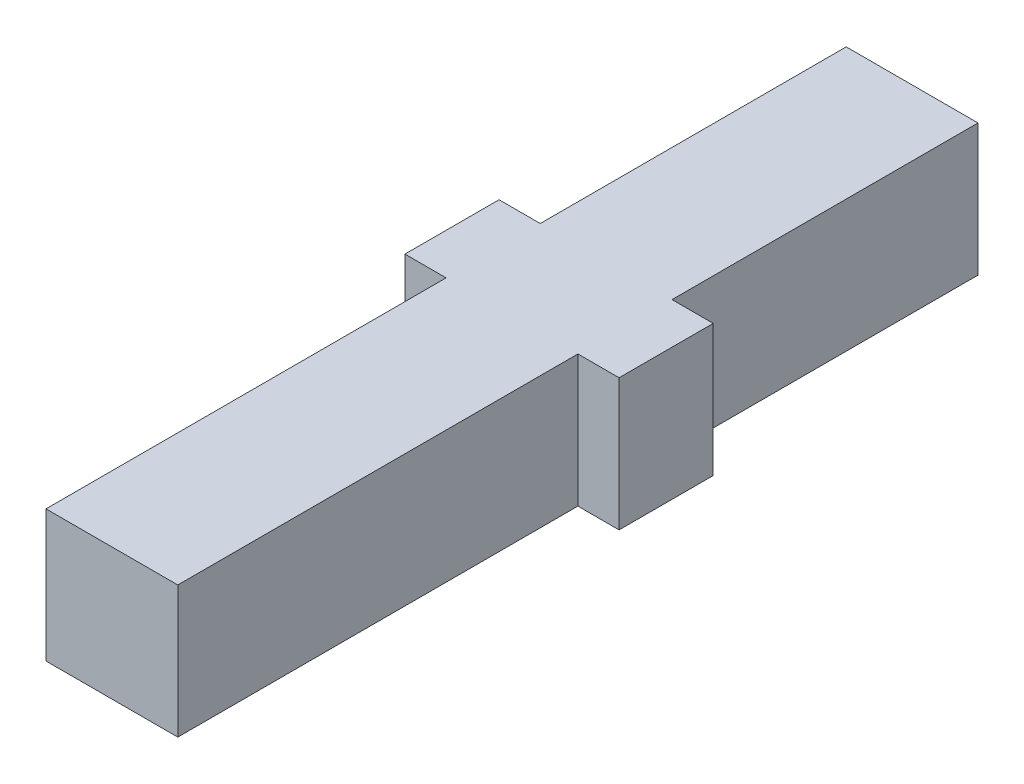
ISO-10303-21;
HEADER;
FILE_DESCRIPTION(('STEP AP214'),'2;1');
FILE_NAME('part.step','',(''),(''),'','','');
FILE_SCHEMA(('AUTOMOTIVE_DESIGN { 1 0 10303 214 1 1 1 1 }'));
ENDSEC;
DATA;
#1=APPLICATION_CONTEXT('core data for automotive mechanical design processes');
#2=APPLICATION_PROTOCOL_DEFINITION('international standard','automotive_design',2000,#1);
#3=PRODUCT_CONTEXT('',#1,'mechanical');
#4=PRODUCT('Part','Part','',(#3));
#5=PRODUCT_RELATED_PRODUCT_CATEGORY('part','',(#4));
#6=PRODUCT_DEFINITION_FORMATION('','',#4);
#7=PRODUCT_DEFINITION_CONTEXT('part definition',#1,'design');
#8=PRODUCT_DEFINITION('design','',#6,#7);
#9=PRODUCT_DEFINITION_SHAPE('','',#8);
#10=(LENGTH_UNIT() NAMED_UNIT(*) SI_UNIT(.MILLI.,.METRE.));
#11=(NAMED_UNIT(*) PLANE_ANGLE_UNIT() SI_UNIT($,.RADIAN.));
#12=(NAMED_UNIT(*) SI_UNIT($,.STERADIAN.) SOLID_ANGLE_UNIT());
#13=UNCERTAINTY_MEASURE_WITH_UNIT(LENGTH_MEASURE(1.E-05),#10,'distance_accuracy_value','');
#14=(GEOMETRIC_REPRESENTATION_CONTEXT(3) GLOBAL_UNCERTAINTY_ASSIGNED_CONTEXT((#13)) GLOBAL_UNIT_ASSIGNED_CONTEXT((#10,
#11,#12)) REPRESENTATION_CONTEXT('',''));
#15=CARTESIAN_POINT('',(0.,0.,0.));
#16=DIRECTION('',(0.,0.,1.));
#17=DIRECTION('',(1.,0.,0.));
#18=AXIS2_PLACEMENT_3D('',#15,#16,#17);
#19=CARTESIAN_POINT('',(3.775,0.1,17.));
#20=DIRECTION('',(-1.,0.,0.));
#21=DIRECTION('',(0.,-1.,0.));
#22=AXIS2_PLACEMENT_3D('',#19,#20,#21);
#23=PLANE('',#22);
#24=DIRECTION('',(0.,1.,0.));
#25=VECTOR('',#24,1.);
#26=CARTESIAN_POINT('',(3.775,0.1,6.5));
#27=LINE('',#26,#25);
#28=CARTESIAN_POINT('',(3.775,0.1,6.5));
#29=VERTEX_POINT('',#28);
#30=CARTESIAN_POINT('',(3.775,2.90000000000001,6.5));
#31=VERTEX_POINT('',#30);
#32=EDGE_CURVE('E53',#29,#31,#27,.T.);
#33=ORIENTED_EDGE('',*,*,#32,.F.);
#34=DIRECTION('',(0.,0.,-1.));
#35=VECTOR('',#34,1.);
#36=CARTESIAN_POINT('',(3.775,0.1,17.));
#37=LINE('',#36,#35);
#38=CARTESIAN_POINT('',(3.775,0.1,0.));
#39=VERTEX_POINT('',#38);
#40=EDGE_CURVE('E191',#29,#39,#37,.T.);
#41=ORIENTED_EDGE('',*,*,#40,.T.);
#42=DIRECTION('',(0.,1.,0.));
#43=VECTOR('',#42,1.);
#44=CARTESIAN_POINT('',(3.775,0.1,0.));
#45=LINE('',#44,#43);
#46=CARTESIAN_POINT('',(3.775,2.9,0.));
#47=VERTEX_POINT('',#46);
#48=EDGE_CURVE('E173',#39,#47,#45,.T.);
#49=ORIENTED_EDGE('',*,*,#48,.T.);
#50=DIRECTION('',(0.,0.,-1.));
#51=VECTOR('',#50,1.);
#52=CARTESIAN_POINT('',(3.775,2.9,17.));
#53=LINE('',#52,#51);
#54=EDGE_CURVE('E186',#31,#47,#53,.T.);
#55=ORIENTED_EDGE('',*,*,#54,.F.);
#56=EDGE_LOOP('',(#33,#41,#49,#55));
#57=FACE_BOUND('',#56,.T.);
#58=ADVANCED_FACE('F39',(#57),#23,.F.);
#59=CARTESIAN_POINT('',(0.975,0.1,17.));
#60=DIRECTION('',(-1.,0.,0.));
#61=DIRECTION('',(0.,0.,1.));
#62=AXIS2_PLACEMENT_3D('',#59,#60,#61);
#63=PLANE('',#62);
#64=DIRECTION('',(0.,0.,-1.));
#65=VECTOR('',#64,1.);
#66=CARTESIAN_POINT('',(0.975,0.1,17.));
#67=LINE('',#66,#65);
#68=CARTESIAN_POINT('',(0.975,0.1,6.5));
#69=VERTEX_POINT('',#68);
#70=CARTESIAN_POINT('',(0.975,0.1,0.));
#71=VERTEX_POINT('',#70);
#72=EDGE_CURVE('E175',#69,#71,#67,.T.);
#73=ORIENTED_EDGE('',*,*,#72,.F.);
#74=DIRECTION('',(0.,1.,0.));
#75=VECTOR('',#74,1.);
#76=CARTESIAN_POINT('',(0.975,0.1,6.5));
#77=LINE('',#76,#75);
#78=CARTESIAN_POINT('',(0.975,2.9,6.5));
#79=VERTEX_POINT('',#78);
#80=EDGE_CURVE('E50',#69,#79,#77,.T.);
#81=ORIENTED_EDGE('',*,*,#80,.T.);
#82=DIRECTION('',(0.,0.,-1.));
#83=VECTOR('',#82,1.);
#84=CARTESIAN_POINT('',(0.975,2.9,17.));
#85=LINE('',#84,#83);
#86=CARTESIAN_POINT('',(0.975,2.9,0.));
#87=VERTEX_POINT('',#86);
#88=EDGE_CURVE('E183',#79,#87,#85,.T.);
#89=ORIENTED_EDGE('',*,*,#88,.T.);
#90=DIRECTION('',(0.,1.,0.));
#91=VECTOR('',#90,1.);
#92=CARTESIAN_POINT('',(0.975,0.1,0.));
#93=LINE('',#92,#91);
#94=EDGE_CURVE('E163',#71,#87,#93,.T.);
#95=ORIENTED_EDGE('',*,*,#94,.F.);
#96=EDGE_LOOP('',(#73,#81,#89,#95));
#97=FACE_BOUND('',#96,.T.);
#98=ADVANCED_FACE('F196',(#97),#63,.T.);
#99=CARTESIAN_POINT('',(0.975,0.1,17.));
#100=DIRECTION('',(0.,1.,0.));
#101=DIRECTION('',(0.,0.,1.));
#102=AXIS2_PLACEMENT_3D('',#99,#100,#101);
#103=PLANE('',#102);
#104=CARTESIAN_POINT('',(0.975,0.1,17.));
#105=VERTEX_POINT('',#104);
#106=CARTESIAN_POINT('',(0.975,0.1,8.5));
#107=VERTEX_POINT('',#106);
#108=EDGE_CURVE('E181',#105,#107,#67,.T.);
#109=ORIENTED_EDGE('',*,*,#108,.T.);
#110=DIRECTION('',(1.,0.,0.));
#111=VECTOR('',#110,1.);
#112=CARTESIAN_POINT('',(0.1,0.1,8.5));
#113=LINE('',#112,#111);
#114=CARTESIAN_POINT('',(0.1,0.1,8.5));
#115=VERTEX_POINT('',#114);
#116=EDGE_CURVE('E138',#115,#107,#113,.T.);
#117=ORIENTED_EDGE('',*,*,#116,.F.);
#118=DIRECTION('',(0.,0.,-1.));
#119=VECTOR('',#118,1.);
#120=CARTESIAN_POINT('',(0.1,0.1,8.5));
#121=LINE('',#120,#119);
#122=CARTESIAN_POINT('',(0.1,0.1,6.5));
#123=VERTEX_POINT('',#122);
#124=EDGE_CURVE('E216',#115,#123,#121,.T.);
#125=ORIENTED_EDGE('',*,*,#124,.T.);
#126=DIRECTION('',(1.,0.,0.));
#127=VECTOR('',#126,1.);
#128=CARTESIAN_POINT('',(0.1,0.1,6.5));
#129=LINE('',#128,#127);
#130=EDGE_CURVE('E212',#123,#69,#129,.T.);
#131=ORIENTED_EDGE('',*,*,#130,.T.);
#132=ORIENTED_EDGE('',*,*,#72,.T.);
#133=DIRECTION('',(1.,0.,0.));
#134=VECTOR('',#133,1.);
#135=CARTESIAN_POINT('',(0.975,0.1,0.));
#136=LINE('',#135,#134);
#137=EDGE_CURVE('E157',#71,#39,#136,.T.);
#138=ORIENTED_EDGE('',*,*,#137,.T.);
#139=ORIENTED_EDGE('',*,*,#40,.F.);
#140=CARTESIAN_POINT('',(4.65,0.1,6.5));
#141=VERTEX_POINT('',#140);
#142=EDGE_CURVE('E147',#29,#141,#129,.T.);
#143=ORIENTED_EDGE('',*,*,#142,.T.);
#144=DIRECTION('',(0.,0.,-1.));
#145=VECTOR('',#144,1.);
#146=CARTESIAN_POINT('',(4.65,0.1,8.5));
#147=LINE('',#146,#145);
#148=CARTESIAN_POINT('',(4.65,0.1,8.5));
#149=VERTEX_POINT('',#148);
#150=EDGE_CURVE('E141',#149,#141,#147,.T.);
#151=ORIENTED_EDGE('',*,*,#150,.F.);
#152=CARTESIAN_POINT('',(3.775,0.1,8.5));
#153=VERTEX_POINT('',#152);
#154=EDGE_CURVE('E130',#153,#149,#113,.T.);
#155=ORIENTED_EDGE('',*,*,#154,.F.);
#156=CARTESIAN_POINT('',(3.775,0.1,17.));
#157=VERTEX_POINT('',#156);
#158=EDGE_CURVE('E65',#157,#153,#37,.T.);
#159=ORIENTED_EDGE('',*,*,#158,.F.);
#160=DIRECTION('',(1.,0.,0.));
#161=VECTOR('',#160,1.);
#162=CARTESIAN_POINT('',(0.975,0.1,17.));
#163=LINE('',#162,#161);
#164=EDGE_CURVE('E159',#105,#157,#163,.T.);
#165=ORIENTED_EDGE('',*,*,#164,.F.);
#166=EDGE_LOOP('',(#109,#117,#125,#131,#132,#138,#139,#143,#151,#155,#159,#165));
#167=FACE_BOUND('',#166,.T.);
#168=ADVANCED_FACE('F41',(#167),#103,.F.);
#169=ORIENTED_EDGE('',*,*,#158,.T.);
#170=DIRECTION('',(0.,1.,0.));
#171=VECTOR('',#170,1.);
#172=CARTESIAN_POINT('',(3.775,0.1,8.5));
#173=LINE('',#172,#171);
#174=CARTESIAN_POINT('',(3.775,2.9,8.5));
#175=VERTEX_POINT('',#174);
#176=EDGE_CURVE('E134',#153,#175,#173,.T.);
#177=ORIENTED_EDGE('',*,*,#176,.T.);
#178=CARTESIAN_POINT('',(3.775,2.9,17.));
#179=VERTEX_POINT('',#178);
#180=EDGE_CURVE('E188',#179,#175,#53,.T.);
#181=ORIENTED_EDGE('',*,*,#180,.F.);
#182=DIRECTION('',(0.,1.,0.));
#183=VECTOR('',#182,1.);
#184=CARTESIAN_POINT('',(3.775,0.1,17.));
#185=LINE('',#184,#183);
#186=EDGE_CURVE('E162',#157,#179,#185,.T.);
#187=ORIENTED_EDGE('',*,*,#186,.F.);
#188=EDGE_LOOP('',(#169,#177,#181,#187));
#189=FACE_BOUND('',#188,.T.);
#190=ADVANCED_FACE('F248',(#189),#23,.F.);
#191=CARTESIAN_POINT('',(0.975,2.9,17.));
#192=DIRECTION('',(0.,1.,0.));
#193=DIRECTION('',(0.,0.,1.));
#194=AXIS2_PLACEMENT_3D('',#191,#192,#193);
#195=PLANE('',#194);
#196=ORIENTED_EDGE('',*,*,#180,.T.);
#197=DIRECTION('',(1.,0.,0.));
#198=VECTOR('',#197,1.);
#199=CARTESIAN_POINT('',(0.1,2.90000000000001,8.5));
#200=LINE('',#199,#198);
#201=CARTESIAN_POINT('',(4.65,2.90000000000001,8.5));
#202=VERTEX_POINT('',#201);
#203=EDGE_CURVE('E148',#175,#202,#200,.T.);
#204=ORIENTED_EDGE('',*,*,#203,.T.);
#205=DIRECTION('',(0.,0.,-1.));
#206=VECTOR('',#205,1.);
#207=CARTESIAN_POINT('',(4.65,2.90000000000001,8.5));
#208=LINE('',#207,#206);
#209=CARTESIAN_POINT('',(4.65,2.90000000000001,6.5));
#210=VERTEX_POINT('',#209);
#211=EDGE_CURVE('E144',#202,#210,#208,.T.);
#212=ORIENTED_EDGE('',*,*,#211,.T.);
#213=DIRECTION('',(1.,0.,0.));
#214=VECTOR('',#213,1.);
#215=CARTESIAN_POINT('',(0.1,2.90000000000001,6.5));
#216=LINE('',#215,#214);
#217=EDGE_CURVE('E219',#31,#210,#216,.T.);
#218=ORIENTED_EDGE('',*,*,#217,.F.);
#219=ORIENTED_EDGE('',*,*,#54,.T.);
#220=DIRECTION('',(1.,0.,0.));
#221=VECTOR('',#220,1.);
#222=CARTESIAN_POINT('',(0.975,2.9,0.));
#223=LINE('',#222,#221);
#224=EDGE_CURVE('E176',#87,#47,#223,.T.);
#225=ORIENTED_EDGE('',*,*,#224,.F.);
#226=ORIENTED_EDGE('',*,*,#88,.F.);
#227=CARTESIAN_POINT('',(0.1,2.90000000000001,6.5));
#228=VERTEX_POINT('',#227);
#229=EDGE_CURVE('E210',#228,#79,#216,.T.);
#230=ORIENTED_EDGE('',*,*,#229,.F.);
#231=DIRECTION('',(0.,0.,-1.));
#232=VECTOR('',#231,1.);
#233=CARTESIAN_POINT('',(0.1,2.90000000000001,8.5));
#234=LINE('',#233,#232);
#235=CARTESIAN_POINT('',(0.1,2.90000000000001,8.5));
#236=VERTEX_POINT('',#235);
#237=EDGE_CURVE('E152',#236,#228,#234,.T.);
#238=ORIENTED_EDGE('',*,*,#237,.F.);
#239=CARTESIAN_POINT('',(0.975,2.90000000000001,8.5));
#240=VERTEX_POINT('',#239);
#241=EDGE_CURVE('E232',#236,#240,#200,.T.);
#242=ORIENTED_EDGE('',*,*,#241,.T.);
#243=CARTESIAN_POINT('',(0.975,2.9,17.));
#244=VERTEX_POINT('',#243);
#245=EDGE_CURVE('E187',#244,#240,#85,.T.);
#246=ORIENTED_EDGE('',*,*,#245,.F.);
#247=DIRECTION('',(1.,0.,0.));
#248=VECTOR('',#247,1.);
#249=CARTESIAN_POINT('',(0.975,2.9,17.));
#250=LINE('',#249,#248);
#251=EDGE_CURVE('E167',#244,#179,#250,.T.);
#252=ORIENTED_EDGE('',*,*,#251,.T.);
#253=EDGE_LOOP('',(#196,#204,#212,#218,#219,#225,#226,#230,#238,#242,#246,#252));
#254=FACE_BOUND('',#253,.T.);
#255=ADVANCED_FACE('F206',(#254),#195,.T.);
#256=DIRECTION('',(0.,1.,0.));
#257=VECTOR('',#256,1.);
#258=CARTESIAN_POINT('',(0.975,0.1,8.5));
#259=LINE('',#258,#257);
#260=EDGE_CURVE('E11',#107,#240,#259,.T.);
#261=ORIENTED_EDGE('',*,*,#260,.F.);
#262=ORIENTED_EDGE('',*,*,#108,.F.);
#263=DIRECTION('',(0.,1.,0.));
#264=VECTOR('',#263,1.);
#265=CARTESIAN_POINT('',(0.975,0.1,17.));
#266=LINE('',#265,#264);
#267=EDGE_CURVE('E166',#105,#244,#266,.T.);
#268=ORIENTED_EDGE('',*,*,#267,.T.);
#269=ORIENTED_EDGE('',*,*,#245,.T.);
#270=EDGE_LOOP('',(#261,#262,#268,#269));
#271=FACE_BOUND('',#270,.T.);
#272=ADVANCED_FACE('F239',(#271),#63,.T.);
#273=CARTESIAN_POINT('',(0.,0.,17.));
#274=DIRECTION('',(0.,0.,1.));
#275=DIRECTION('',(1.,0.,0.));
#276=AXIS2_PLACEMENT_3D('',#273,#274,#275);
#277=PLANE('',#276);
#278=ORIENTED_EDGE('',*,*,#164,.T.);
#279=ORIENTED_EDGE('',*,*,#186,.T.);
#280=ORIENTED_EDGE('',*,*,#251,.F.);
#281=ORIENTED_EDGE('',*,*,#267,.F.);
#282=EDGE_LOOP('',(#278,#279,#280,#281));
#283=FACE_BOUND('',#282,.T.);
#284=ADVANCED_FACE('F241',(#283),#277,.T.);
#285=CARTESIAN_POINT('',(0.,0.,0.));
#286=DIRECTION('',(0.,0.,1.));
#287=DIRECTION('',(1.,0.,0.));
#288=AXIS2_PLACEMENT_3D('',#285,#286,#287);
#289=PLANE('',#288);
#290=ORIENTED_EDGE('',*,*,#137,.F.);
#291=ORIENTED_EDGE('',*,*,#94,.T.);
#292=ORIENTED_EDGE('',*,*,#224,.T.);
#293=ORIENTED_EDGE('',*,*,#48,.F.);
#294=EDGE_LOOP('',(#290,#291,#292,#293));
#295=FACE_BOUND('',#294,.T.);
#296=ADVANCED_FACE('F213',(#295),#289,.F.);
#297=CARTESIAN_POINT('',(0.1,0.1,8.5));
#298=DIRECTION('',(-1.,0.,0.));
#299=DIRECTION('',(0.,0.,1.));
#300=AXIS2_PLACEMENT_3D('',#297,#298,#299);
#301=PLANE('',#300);
#302=DIRECTION('',(0.,1.,0.));
#303=VECTOR('',#302,1.);
#304=CARTESIAN_POINT('',(0.1,0.1,6.5));
#305=LINE('',#304,#303);
#306=EDGE_CURVE('E140',#123,#228,#305,.T.);
#307=ORIENTED_EDGE('',*,*,#306,.F.);
#308=ORIENTED_EDGE('',*,*,#124,.F.);
#309=DIRECTION('',(0.,1.,0.));
#310=VECTOR('',#309,1.);
#311=CARTESIAN_POINT('',(0.1,0.1,8.5));
#312=LINE('',#311,#310);
#313=EDGE_CURVE('E224',#115,#236,#312,.T.);
#314=ORIENTED_EDGE('',*,*,#313,.T.);
#315=ORIENTED_EDGE('',*,*,#237,.T.);
#316=EDGE_LOOP('',(#307,#308,#314,#315));
#317=FACE_BOUND('',#316,.T.);
#318=ADVANCED_FACE('F228',(#317),#301,.T.);
#319=CARTESIAN_POINT('',(0.,0.,6.5));
#320=DIRECTION('',(0.,0.,1.));
#321=DIRECTION('',(1.,0.,0.));
#322=AXIS2_PLACEMENT_3D('',#319,#320,#321);
#323=PLANE('',#322);
#324=ORIENTED_EDGE('',*,*,#80,.F.);
#325=ORIENTED_EDGE('',*,*,#130,.F.);
#326=ORIENTED_EDGE('',*,*,#306,.T.);
#327=ORIENTED_EDGE('',*,*,#229,.T.);
#328=EDGE_LOOP('',(#324,#325,#326,#327));
#329=FACE_BOUND('',#328,.T.);
#330=ADVANCED_FACE('F274',(#329),#323,.F.);
#331=CARTESIAN_POINT('',(0.,0.,8.5));
#332=DIRECTION('',(0.,0.,1.));
#333=DIRECTION('',(1.,0.,0.));
#334=AXIS2_PLACEMENT_3D('',#331,#332,#333);
#335=PLANE('',#334);
#336=ORIENTED_EDGE('',*,*,#116,.T.);
#337=ORIENTED_EDGE('',*,*,#260,.T.);
#338=ORIENTED_EDGE('',*,*,#241,.F.);
#339=ORIENTED_EDGE('',*,*,#313,.F.);
#340=EDGE_LOOP('',(#336,#337,#338,#339));
#341=FACE_BOUND('',#340,.T.);
#342=ADVANCED_FACE('F237',(#341),#335,.T.);
#343=ORIENTED_EDGE('',*,*,#176,.F.);
#344=ORIENTED_EDGE('',*,*,#154,.T.);
#345=DIRECTION('',(0.,1.,0.));
#346=VECTOR('',#345,1.);
#347=CARTESIAN_POINT('',(4.65,0.1,8.5));
#348=LINE('',#347,#346);
#349=EDGE_CURVE('E132',#149,#202,#348,.T.);
#350=ORIENTED_EDGE('',*,*,#349,.T.);
#351=ORIENTED_EDGE('',*,*,#203,.F.);
#352=EDGE_LOOP('',(#343,#344,#350,#351));
#353=FACE_BOUND('',#352,.T.);
#354=ADVANCED_FACE('F129',(#353),#335,.T.);
#355=ORIENTED_EDGE('',*,*,#142,.F.);
#356=ORIENTED_EDGE('',*,*,#32,.T.);
#357=ORIENTED_EDGE('',*,*,#217,.T.);
#358=DIRECTION('',(0.,1.,0.));
#359=VECTOR('',#358,1.);
#360=CARTESIAN_POINT('',(4.65,0.1,6.5));
#361=LINE('',#360,#359);
#362=EDGE_CURVE('E217',#141,#210,#361,.T.);
#363=ORIENTED_EDGE('',*,*,#362,.F.);
#364=EDGE_LOOP('',(#355,#356,#357,#363));
#365=FACE_BOUND('',#364,.T.);
#366=ADVANCED_FACE('F272',(#365),#323,.F.);
#367=CARTESIAN_POINT('',(4.65,0.1,8.5));
#368=DIRECTION('',(-1.,0.,0.));
#369=DIRECTION('',(0.,0.,1.));
#370=AXIS2_PLACEMENT_3D('',#367,#368,#369);
#371=PLANE('',#370);
#372=ORIENTED_EDGE('',*,*,#362,.T.);
#373=ORIENTED_EDGE('',*,*,#211,.F.);
#374=ORIENTED_EDGE('',*,*,#349,.F.);
#375=ORIENTED_EDGE('',*,*,#150,.T.);
#376=EDGE_LOOP('',(#372,#373,#374,#375));
#377=FACE_BOUND('',#376,.T.);
#378=ADVANCED_FACE('F142',(#377),#371,.F.);
#379=CLOSED_SHELL('',(#58,#98,#168,#190,#255,#272,#284,#296,#318,#330,#342,#354,#366,#378));
#380=MANIFOLD_SOLID_BREP('B2',#379);
#381=ADVANCED_BREP_SHAPE_REPRESENTATION('',(#18,#380),#14);
#382=SHAPE_DEFINITION_REPRESENTATION(#9,#381);
ENDSEC;
END-ISO-10303-21;
